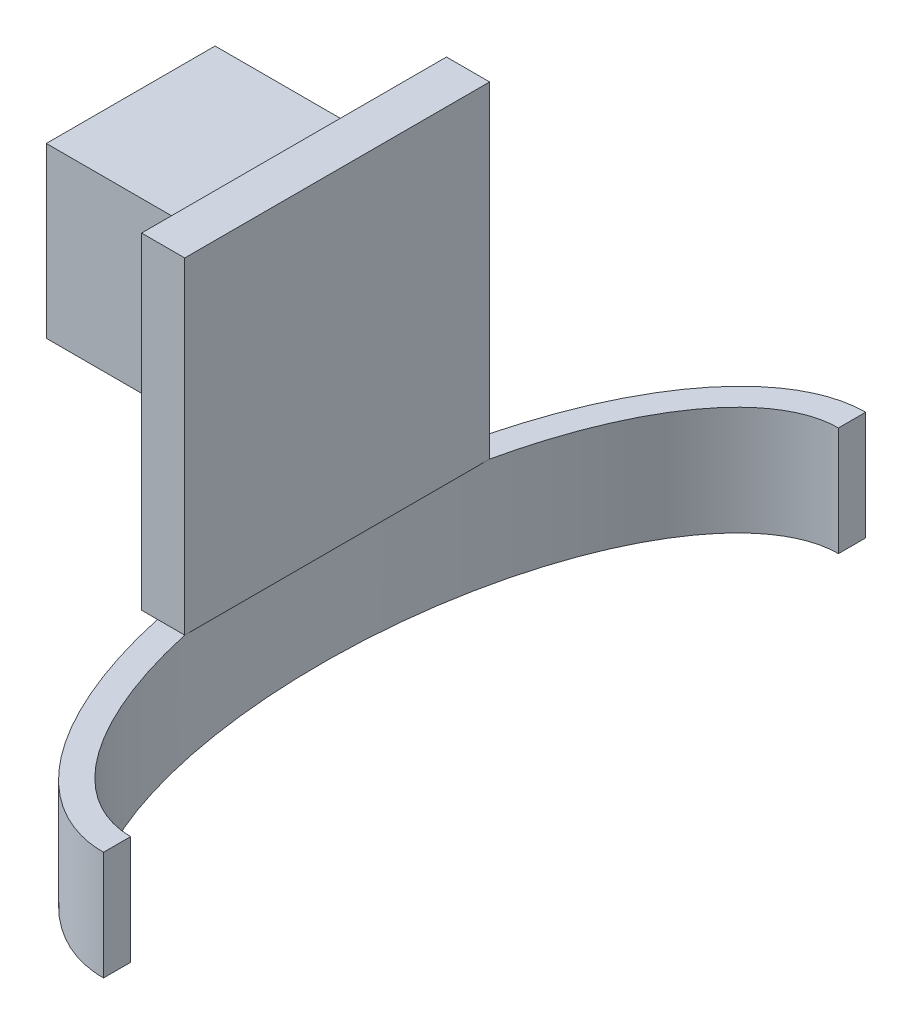
ISO-10303-21;
HEADER;
FILE_DESCRIPTION(('STEP AP214'),'2;1');
FILE_NAME('part.step','',(''),(''),'','','');
FILE_SCHEMA(('AUTOMOTIVE_DESIGN { 1 0 10303 214 1 1 1 1 }'));
ENDSEC;
DATA;
#1=APPLICATION_CONTEXT('core data for automotive mechanical design processes');
#2=APPLICATION_PROTOCOL_DEFINITION('international standard','automotive_design',2000,#1);
#3=PRODUCT_CONTEXT('',#1,'mechanical');
#4=PRODUCT('Part','Part','',(#3));
#5=PRODUCT_RELATED_PRODUCT_CATEGORY('part','',(#4));
#6=PRODUCT_DEFINITION_FORMATION('','',#4);
#7=PRODUCT_DEFINITION_CONTEXT('part definition',#1,'design');
#8=PRODUCT_DEFINITION('design','',#6,#7);
#9=PRODUCT_DEFINITION_SHAPE('','',#8);
#10=(LENGTH_UNIT() NAMED_UNIT(*) SI_UNIT(.MILLI.,.METRE.));
#11=(NAMED_UNIT(*) PLANE_ANGLE_UNIT() SI_UNIT($,.RADIAN.));
#12=(NAMED_UNIT(*) SI_UNIT($,.STERADIAN.) SOLID_ANGLE_UNIT());
#13=UNCERTAINTY_MEASURE_WITH_UNIT(LENGTH_MEASURE(1.E-05),#10,'distance_accuracy_value','');
#14=(GEOMETRIC_REPRESENTATION_CONTEXT(3) GLOBAL_UNCERTAINTY_ASSIGNED_CONTEXT((#13)) GLOBAL_UNIT_ASSIGNED_CONTEXT((#10,
#11,#12)) REPRESENTATION_CONTEXT('',''));
#15=CARTESIAN_POINT('',(0.,0.,0.));
#16=DIRECTION('',(0.,0.,1.));
#17=DIRECTION('',(1.,0.,0.));
#18=AXIS2_PLACEMENT_3D('',#15,#16,#17);
#19=CARTESIAN_POINT('',(-3.5,8.,2.8));
#20=DIRECTION('',(1.,0.,0.));
#21=DIRECTION('',(0.,0.,-1.));
#22=AXIS2_PLACEMENT_3D('',#19,#20,#21);
#23=PLANE('',#22);
#24=DIRECTION('',(0.,0.,1.));
#25=VECTOR('',#24,1.);
#26=CARTESIAN_POINT('',(-3.5,2.,2.8));
#27=LINE('',#26,#25);
#28=CARTESIAN_POINT('',(-3.5,2.,-2.8));
#29=VERTEX_POINT('',#28);
#30=CARTESIAN_POINT('',(-3.5,2.,0.));
#31=VERTEX_POINT('',#30);
#32=EDGE_CURVE('E203',#29,#31,#27,.T.);
#33=ORIENTED_EDGE('',*,*,#32,.T.);
#34=CARTESIAN_POINT('',(-3.5,2.,2.8));
#35=VERTEX_POINT('',#34);
#36=EDGE_CURVE('E202',#31,#35,#27,.T.);
#37=ORIENTED_EDGE('',*,*,#36,.T.);
#38=DIRECTION('',(0.,-1.,0.));
#39=VECTOR('',#38,1.);
#40=CARTESIAN_POINT('',(-3.5,8.,2.8));
#41=LINE('',#40,#39);
#42=CARTESIAN_POINT('',(-3.5,8.,2.8));
#43=VERTEX_POINT('',#42);
#44=EDGE_CURVE('E212',#43,#35,#41,.T.);
#45=ORIENTED_EDGE('',*,*,#44,.F.);
#46=DIRECTION('',(0.,0.,1.));
#47=VECTOR('',#46,1.);
#48=CARTESIAN_POINT('',(-3.5,8.,2.8));
#49=LINE('',#48,#47);
#50=CARTESIAN_POINT('',(-3.5,8.,-2.8));
#51=VERTEX_POINT('',#50);
#52=EDGE_CURVE('E191',#51,#43,#49,.T.);
#53=ORIENTED_EDGE('',*,*,#52,.F.);
#54=DIRECTION('',(0.,-1.,0.));
#55=VECTOR('',#54,1.);
#56=CARTESIAN_POINT('',(-3.5,8.,-2.8));
#57=LINE('',#56,#55);
#58=EDGE_CURVE('E216',#51,#29,#57,.T.);
#59=ORIENTED_EDGE('',*,*,#58,.T.);
#60=EDGE_LOOP('',(#33,#37,#45,#53,#59));
#61=FACE_BOUND('',#60,.T.);
#62=DIRECTION('',(0.,-1.,0.));
#63=VECTOR('',#62,1.);
#64=CARTESIAN_POINT('',(-3.5,7.3,-1.55));
#65=LINE('',#64,#63);
#66=CARTESIAN_POINT('',(-3.5,7.3,-1.55));
#67=VERTEX_POINT('',#66);
#68=CARTESIAN_POINT('',(-3.5,4.2,-1.55));
#69=VERTEX_POINT('',#68);
#70=EDGE_CURVE('E171',#67,#69,#65,.T.);
#71=ORIENTED_EDGE('',*,*,#70,.F.);
#72=DIRECTION('',(0.,0.,-1.));
#73=VECTOR('',#72,1.);
#74=CARTESIAN_POINT('',(-3.5,7.3,-1.55));
#75=LINE('',#74,#73);
#76=CARTESIAN_POINT('',(-3.5,7.3,1.55));
#77=VERTEX_POINT('',#76);
#78=EDGE_CURVE('E168',#77,#67,#75,.T.);
#79=ORIENTED_EDGE('',*,*,#78,.F.);
#80=DIRECTION('',(0.,1.,0.));
#81=VECTOR('',#80,1.);
#82=CARTESIAN_POINT('',(-3.5,7.3,1.55));
#83=LINE('',#82,#81);
#84=CARTESIAN_POINT('',(-3.5,4.2,1.55));
#85=VERTEX_POINT('',#84);
#86=EDGE_CURVE('E71',#85,#77,#83,.T.);
#87=ORIENTED_EDGE('',*,*,#86,.F.);
#88=DIRECTION('',(0.,0.,1.));
#89=VECTOR('',#88,1.);
#90=CARTESIAN_POINT('',(-3.5,4.2,-1.55));
#91=LINE('',#90,#89);
#92=EDGE_CURVE('E66',#69,#85,#91,.T.);
#93=ORIENTED_EDGE('',*,*,#92,.F.);
#94=EDGE_LOOP('',(#71,#79,#87,#93));
#95=FACE_BOUND('',#94,.T.);
#96=ADVANCED_FACE('F47',(#61,#95),#23,.F.);
#97=CARTESIAN_POINT('',(0.,2.,0.));
#98=DIRECTION('',(0.,1.,0.));
#99=DIRECTION('',(0.,0.,1.));
#100=AXIS2_PLACEMENT_3D('',#97,#98,#99);
#101=PLANE('',#100);
#102=DIRECTION('',(1.,0.,0.));
#103=VECTOR('',#102,1.);
#104=CARTESIAN_POINT('',(-2.70738634634999,2.,2.8));
#105=LINE('',#104,#103);
#106=CARTESIAN_POINT('',(-3.20780298646909,2.,2.8));
#107=VERTEX_POINT('',#106);
#108=CARTESIAN_POINT('',(-2.70738634634999,2.,2.8));
#109=VERTEX_POINT('',#108);
#110=EDGE_CURVE('E11',#107,#109,#105,.T.);
#111=ORIENTED_EDGE('',*,*,#110,.F.);
#112=CARTESIAN_POINT('',(0.,2.,0.));
#113=DIRECTION('',(0.,1.,0.));
#114=DIRECTION('',(0.,0.,1.));
#115=AXIS2_PLACEMENT_3D('',#112,#113,#114);
#116=ELLIPSE('',#115,7.,3.5);
#117=CARTESIAN_POINT('',(0.,2.,7.));
#118=VERTEX_POINT('',#117);
#119=EDGE_CURVE('E235',#107,#118,#116,.T.);
#120=ORIENTED_EDGE('',*,*,#119,.T.);
#121=DIRECTION('',(0.,0.,-1.));
#122=VECTOR('',#121,1.);
#123=CARTESIAN_POINT('',(0.,2.,0.));
#124=LINE('',#123,#122);
#125=CARTESIAN_POINT('',(0.,2.,6.5));
#126=VERTEX_POINT('',#125);
#127=EDGE_CURVE('E240',#118,#126,#124,.T.);
#128=ORIENTED_EDGE('',*,*,#127,.T.);
#129=CARTESIAN_POINT('',(0.,2.,0.));
#130=DIRECTION('',(0.,1.,0.));
#131=DIRECTION('',(0.,0.,-1.));
#132=AXIS2_PLACEMENT_3D('',#129,#130,#131);
#133=ELLIPSE('',#132,6.5,3.);
#134=EDGE_CURVE('E231',#109,#126,#133,.T.);
#135=ORIENTED_EDGE('',*,*,#134,.F.);
#136=EDGE_LOOP('',(#111,#120,#128,#135));
#137=FACE_BOUND('',#136,.T.);
#138=ADVANCED_FACE('F257',(#137),#101,.T.);
#139=DIRECTION('',(0.,-1.,0.));
#140=VECTOR('',#139,1.);
#141=SURFACE_OF_LINEAR_EXTRUSION('',#133,#140);
#142=CARTESIAN_POINT('',(0.,0.,0.));
#143=DIRECTION('',(0.,1.,0.));
#144=DIRECTION('',(0.,0.,-1.));
#145=AXIS2_PLACEMENT_3D('',#142,#143,#144);
#146=ELLIPSE('',#145,6.5,3.);
#147=CARTESIAN_POINT('',(0.,0.,-6.5));
#148=VERTEX_POINT('',#147);
#149=CARTESIAN_POINT('',(0.,0.,6.5));
#150=VERTEX_POINT('',#149);
#151=EDGE_CURVE('E223',#148,#150,#146,.T.);
#152=ORIENTED_EDGE('',*,*,#151,.F.);
#153=DIRECTION('',(0.,-1.,0.));
#154=VECTOR('',#153,1.);
#155=CARTESIAN_POINT('',(0.,2.,-6.5));
#156=LINE('',#155,#154);
#157=CARTESIAN_POINT('',(0.,2.,-6.5));
#158=VERTEX_POINT('',#157);
#159=EDGE_CURVE('E52',#158,#148,#156,.T.);
#160=ORIENTED_EDGE('',*,*,#159,.F.);
#161=CARTESIAN_POINT('',(-2.70738634634999,2.,-2.8));
#162=VERTEX_POINT('',#161);
#163=EDGE_CURVE('E224',#158,#162,#133,.T.);
#164=ORIENTED_EDGE('',*,*,#163,.T.);
#165=EDGE_CURVE('E230',#162,#109,#133,.T.);
#166=ORIENTED_EDGE('',*,*,#165,.T.);
#167=ORIENTED_EDGE('',*,*,#134,.T.);
#168=DIRECTION('',(0.,-1.,0.));
#169=VECTOR('',#168,1.);
#170=CARTESIAN_POINT('',(0.,2.,6.5));
#171=LINE('',#170,#169);
#172=EDGE_CURVE('E311',#126,#150,#171,.T.);
#173=ORIENTED_EDGE('',*,*,#172,.T.);
#174=EDGE_LOOP('',(#152,#160,#164,#166,#167,#173));
#175=FACE_BOUND('',#174,.T.);
#176=ADVANCED_FACE('F49',(#175),#141,.T.);
#177=CARTESIAN_POINT('',(0.,2.,0.));
#178=DIRECTION('',(1.,0.,0.));
#179=DIRECTION('',(0.,0.,-1.));
#180=AXIS2_PLACEMENT_3D('',#177,#178,#179);
#181=PLANE('',#180);
#182=DIRECTION('',(0.,0.,1.));
#183=VECTOR('',#182,1.);
#184=CARTESIAN_POINT('',(0.,0.,0.));
#185=LINE('',#184,#183);
#186=CARTESIAN_POINT('',(0.,0.,-7.));
#187=VERTEX_POINT('',#186);
#188=EDGE_CURVE('E301',#187,#148,#185,.T.);
#189=ORIENTED_EDGE('',*,*,#188,.F.);
#190=DIRECTION('',(0.,-1.,0.));
#191=VECTOR('',#190,1.);
#192=CARTESIAN_POINT('',(0.,2.,-7.));
#193=LINE('',#192,#191);
#194=CARTESIAN_POINT('',(0.,2.,-7.));
#195=VERTEX_POINT('',#194);
#196=EDGE_CURVE('E317',#195,#187,#193,.T.);
#197=ORIENTED_EDGE('',*,*,#196,.F.);
#198=DIRECTION('',(0.,0.,1.));
#199=VECTOR('',#198,1.);
#200=CARTESIAN_POINT('',(0.,2.,0.));
#201=LINE('',#200,#199);
#202=EDGE_CURVE('E229',#195,#158,#201,.T.);
#203=ORIENTED_EDGE('',*,*,#202,.T.);
#204=ORIENTED_EDGE('',*,*,#159,.T.);
#205=EDGE_LOOP('',(#189,#197,#203,#204));
#206=FACE_BOUND('',#205,.T.);
#207=ADVANCED_FACE('F248',(#206),#181,.T.);
#208=DIRECTION('',(0.,-1.,0.));
#209=VECTOR('',#208,1.);
#210=SURFACE_OF_LINEAR_EXTRUSION('',#116,#209);
#211=CARTESIAN_POINT('',(0.,0.,0.));
#212=DIRECTION('',(0.,1.,0.));
#213=DIRECTION('',(0.,0.,1.));
#214=AXIS2_PLACEMENT_3D('',#211,#212,#213);
#215=ELLIPSE('',#214,7.,3.5);
#216=CARTESIAN_POINT('',(0.,0.,7.));
#217=VERTEX_POINT('',#216);
#218=EDGE_CURVE('E304',#187,#217,#215,.T.);
#219=ORIENTED_EDGE('',*,*,#218,.T.);
#220=DIRECTION('',(0.,-1.,0.));
#221=VECTOR('',#220,1.);
#222=CARTESIAN_POINT('',(0.,2.,7.));
#223=LINE('',#222,#221);
#224=EDGE_CURVE('E314',#118,#217,#223,.T.);
#225=ORIENTED_EDGE('',*,*,#224,.F.);
#226=ORIENTED_EDGE('',*,*,#119,.F.);
#227=EDGE_CURVE('E342',#31,#107,#116,.T.);
#228=ORIENTED_EDGE('',*,*,#227,.F.);
#229=CARTESIAN_POINT('',(-3.20780298646909,2.,-2.8));
#230=VERTEX_POINT('',#229);
#231=EDGE_CURVE('E241',#230,#31,#116,.T.);
#232=ORIENTED_EDGE('',*,*,#231,.F.);
#233=EDGE_CURVE('E236',#195,#230,#116,.T.);
#234=ORIENTED_EDGE('',*,*,#233,.F.);
#235=ORIENTED_EDGE('',*,*,#196,.T.);
#236=EDGE_LOOP('',(#219,#225,#226,#228,#232,#234,#235));
#237=FACE_BOUND('',#236,.T.);
#238=ADVANCED_FACE('F244',(#237),#210,.F.);
#239=CARTESIAN_POINT('',(0.,2.,0.));
#240=DIRECTION('',(-1.,0.,0.));
#241=DIRECTION('',(0.,0.,1.));
#242=AXIS2_PLACEMENT_3D('',#239,#240,#241);
#243=PLANE('',#242);
#244=DIRECTION('',(0.,0.,-1.));
#245=VECTOR('',#244,1.);
#246=CARTESIAN_POINT('',(0.,0.,0.));
#247=LINE('',#246,#245);
#248=EDGE_CURVE('E300',#217,#150,#247,.T.);
#249=ORIENTED_EDGE('',*,*,#248,.T.);
#250=ORIENTED_EDGE('',*,*,#172,.F.);
#251=ORIENTED_EDGE('',*,*,#127,.F.);
#252=ORIENTED_EDGE('',*,*,#224,.T.);
#253=EDGE_LOOP('',(#249,#250,#251,#252));
#254=FACE_BOUND('',#253,.T.);
#255=ADVANCED_FACE('F247',(#254),#243,.F.);
#256=DIRECTION('',(-1.,0.,0.));
#257=VECTOR('',#256,1.);
#258=CARTESIAN_POINT('',(-3.5,2.,-2.8));
#259=LINE('',#258,#257);
#260=EDGE_CURVE('E198',#162,#230,#259,.T.);
#261=ORIENTED_EDGE('',*,*,#260,.F.);
#262=ORIENTED_EDGE('',*,*,#163,.F.);
#263=ORIENTED_EDGE('',*,*,#202,.F.);
#264=ORIENTED_EDGE('',*,*,#233,.T.);
#265=EDGE_LOOP('',(#261,#262,#263,#264));
#266=FACE_BOUND('',#265,.T.);
#267=ADVANCED_FACE('F270',(#266),#101,.T.);
#268=CARTESIAN_POINT('',(0.,0.,0.));
#269=DIRECTION('',(0.,1.,0.));
#270=DIRECTION('',(0.,0.,1.));
#271=AXIS2_PLACEMENT_3D('',#268,#269,#270);
#272=PLANE('',#271);
#273=ORIENTED_EDGE('',*,*,#151,.T.);
#274=ORIENTED_EDGE('',*,*,#248,.F.);
#275=ORIENTED_EDGE('',*,*,#218,.F.);
#276=ORIENTED_EDGE('',*,*,#188,.T.);
#277=EDGE_LOOP('',(#273,#274,#275,#276));
#278=FACE_BOUND('',#277,.T.);
#279=ADVANCED_FACE('F284',(#278),#272,.F.);
#280=CARTESIAN_POINT('',(0.,2.,0.));
#281=DIRECTION('',(0.,-1.,0.));
#282=DIRECTION('',(0.,0.,-1.));
#283=AXIS2_PLACEMENT_3D('',#280,#281,#282);
#284=PLANE('',#283);
#285=ORIENTED_EDGE('',*,*,#165,.F.);
#286=DIRECTION('',(0.,0.,-1.));
#287=VECTOR('',#286,1.);
#288=CARTESIAN_POINT('',(-2.70738634634999,2.,-2.8));
#289=LINE('',#288,#287);
#290=EDGE_CURVE('E173',#109,#162,#289,.T.);
#291=ORIENTED_EDGE('',*,*,#290,.F.);
#292=EDGE_LOOP('',(#285,#291));
#293=FACE_BOUND('',#292,.T.);
#294=ADVANCED_FACE('F287',(#293),#284,.T.);
#295=EDGE_CURVE('E178',#230,#29,#259,.T.);
#296=ORIENTED_EDGE('',*,*,#295,.F.);
#297=ORIENTED_EDGE('',*,*,#231,.T.);
#298=ORIENTED_EDGE('',*,*,#32,.F.);
#299=EDGE_LOOP('',(#296,#297,#298));
#300=FACE_BOUND('',#299,.T.);
#301=ADVANCED_FACE('F281',(#300),#284,.T.);
#302=CARTESIAN_POINT('',(-2.70738634634999,8.,-2.8));
#303=DIRECTION('',(-1.,0.,0.));
#304=DIRECTION('',(0.,0.,1.));
#305=AXIS2_PLACEMENT_3D('',#302,#303,#304);
#306=PLANE('',#305);
#307=ORIENTED_EDGE('',*,*,#290,.T.);
#308=DIRECTION('',(0.,-1.,0.));
#309=VECTOR('',#308,1.);
#310=CARTESIAN_POINT('',(-2.70738634634999,8.,-2.8));
#311=LINE('',#310,#309);
#312=CARTESIAN_POINT('',(-2.70738634634999,8.,-2.8));
#313=VERTEX_POINT('',#312);
#314=EDGE_CURVE('E220',#313,#162,#311,.T.);
#315=ORIENTED_EDGE('',*,*,#314,.F.);
#316=DIRECTION('',(0.,0.,-1.));
#317=VECTOR('',#316,1.);
#318=CARTESIAN_POINT('',(-2.70738634634999,8.,-2.8));
#319=LINE('',#318,#317);
#320=CARTESIAN_POINT('',(-2.70738634634999,8.,2.8));
#321=VERTEX_POINT('',#320);
#322=EDGE_CURVE('E184',#321,#313,#319,.T.);
#323=ORIENTED_EDGE('',*,*,#322,.F.);
#324=DIRECTION('',(0.,-1.,0.));
#325=VECTOR('',#324,1.);
#326=CARTESIAN_POINT('',(-2.70738634634999,8.,2.8));
#327=LINE('',#326,#325);
#328=EDGE_CURVE('E196',#321,#109,#327,.T.);
#329=ORIENTED_EDGE('',*,*,#328,.T.);
#330=EDGE_LOOP('',(#307,#315,#323,#329));
#331=FACE_BOUND('',#330,.T.);
#332=ADVANCED_FACE('F278',(#331),#306,.F.);
#333=CARTESIAN_POINT('',(-3.5,8.,-2.8));
#334=DIRECTION('',(0.,0.,1.));
#335=DIRECTION('',(1.,0.,0.));
#336=AXIS2_PLACEMENT_3D('',#333,#334,#335);
#337=PLANE('',#336);
#338=ORIENTED_EDGE('',*,*,#260,.T.);
#339=ORIENTED_EDGE('',*,*,#295,.T.);
#340=ORIENTED_EDGE('',*,*,#58,.F.);
#341=DIRECTION('',(-1.,0.,0.));
#342=VECTOR('',#341,1.);
#343=CARTESIAN_POINT('',(-3.5,8.,-2.8));
#344=LINE('',#343,#342);
#345=EDGE_CURVE('E188',#313,#51,#344,.T.);
#346=ORIENTED_EDGE('',*,*,#345,.F.);
#347=ORIENTED_EDGE('',*,*,#314,.T.);
#348=EDGE_LOOP('',(#338,#339,#340,#346,#347));
#349=FACE_BOUND('',#348,.T.);
#350=ADVANCED_FACE('F275',(#349),#337,.F.);
#351=CARTESIAN_POINT('',(-2.70738634634999,8.,2.8));
#352=DIRECTION('',(0.,0.,-1.));
#353=DIRECTION('',(-1.,0.,0.));
#354=AXIS2_PLACEMENT_3D('',#351,#352,#353);
#355=PLANE('',#354);
#356=EDGE_CURVE('E59',#35,#107,#105,.T.);
#357=ORIENTED_EDGE('',*,*,#356,.T.);
#358=ORIENTED_EDGE('',*,*,#110,.T.);
#359=ORIENTED_EDGE('',*,*,#328,.F.);
#360=DIRECTION('',(1.,0.,0.));
#361=VECTOR('',#360,1.);
#362=CARTESIAN_POINT('',(-2.70738634634999,8.,2.8));
#363=LINE('',#362,#361);
#364=EDGE_CURVE('E194',#43,#321,#363,.T.);
#365=ORIENTED_EDGE('',*,*,#364,.F.);
#366=ORIENTED_EDGE('',*,*,#44,.T.);
#367=EDGE_LOOP('',(#357,#358,#359,#365,#366));
#368=FACE_BOUND('',#367,.T.);
#369=ADVANCED_FACE('F273',(#368),#355,.F.);
#370=CARTESIAN_POINT('',(0.,8.,0.));
#371=DIRECTION('',(0.,-1.,0.));
#372=DIRECTION('',(0.,0.,-1.));
#373=AXIS2_PLACEMENT_3D('',#370,#371,#372);
#374=PLANE('',#373);
#375=ORIENTED_EDGE('',*,*,#322,.T.);
#376=ORIENTED_EDGE('',*,*,#345,.T.);
#377=ORIENTED_EDGE('',*,*,#52,.T.);
#378=ORIENTED_EDGE('',*,*,#364,.T.);
#379=EDGE_LOOP('',(#375,#376,#377,#378));
#380=FACE_BOUND('',#379,.T.);
#381=ADVANCED_FACE('F362',(#380),#374,.F.);
#382=ORIENTED_EDGE('',*,*,#36,.F.);
#383=ORIENTED_EDGE('',*,*,#227,.T.);
#384=ORIENTED_EDGE('',*,*,#356,.F.);
#385=EDGE_LOOP('',(#382,#383,#384));
#386=FACE_BOUND('',#385,.T.);
#387=ADVANCED_FACE('F293',(#386),#284,.T.);
#388=CARTESIAN_POINT('',(-6.5,7.3,-1.55));
#389=DIRECTION('',(0.,0.,1.));
#390=DIRECTION('',(1.,0.,0.));
#391=AXIS2_PLACEMENT_3D('',#388,#389,#390);
#392=PLANE('',#391);
#393=ORIENTED_EDGE('',*,*,#70,.T.);
#394=DIRECTION('',(1.,0.,0.));
#395=VECTOR('',#394,1.);
#396=CARTESIAN_POINT('',(-6.5,4.2,-1.55));
#397=LINE('',#396,#395);
#398=CARTESIAN_POINT('',(-6.5,4.2,-1.55));
#399=VERTEX_POINT('',#398);
#400=EDGE_CURVE('E150',#399,#69,#397,.T.);
#401=ORIENTED_EDGE('',*,*,#400,.F.);
#402=DIRECTION('',(0.,-1.,0.));
#403=VECTOR('',#402,1.);
#404=CARTESIAN_POINT('',(-6.5,7.3,-1.55));
#405=LINE('',#404,#403);
#406=CARTESIAN_POINT('',(-6.5,7.3,-1.55));
#407=VERTEX_POINT('',#406);
#408=EDGE_CURVE('E158',#407,#399,#405,.T.);
#409=ORIENTED_EDGE('',*,*,#408,.F.);
#410=DIRECTION('',(1.,0.,0.));
#411=VECTOR('',#410,1.);
#412=CARTESIAN_POINT('',(-6.5,7.3,-1.55));
#413=LINE('',#412,#411);
#414=EDGE_CURVE('E496',#407,#67,#413,.T.);
#415=ORIENTED_EDGE('',*,*,#414,.T.);
#416=EDGE_LOOP('',(#393,#401,#409,#415));
#417=FACE_BOUND('',#416,.T.);
#418=ADVANCED_FACE('F170',(#417),#392,.F.);
#419=CARTESIAN_POINT('',(-6.5,4.2,-1.55));
#420=DIRECTION('',(0.,1.,0.));
#421=DIRECTION('',(0.,0.,1.));
#422=AXIS2_PLACEMENT_3D('',#419,#420,#421);
#423=PLANE('',#422);
#424=ORIENTED_EDGE('',*,*,#92,.T.);
#425=DIRECTION('',(1.,0.,0.));
#426=VECTOR('',#425,1.);
#427=CARTESIAN_POINT('',(-6.5,4.2,1.55));
#428=LINE('',#427,#426);
#429=CARTESIAN_POINT('',(-6.5,4.2,1.55));
#430=VERTEX_POINT('',#429);
#431=EDGE_CURVE('E153',#430,#85,#428,.T.);
#432=ORIENTED_EDGE('',*,*,#431,.F.);
#433=DIRECTION('',(0.,0.,1.));
#434=VECTOR('',#433,1.);
#435=CARTESIAN_POINT('',(-6.5,4.2,-1.55));
#436=LINE('',#435,#434);
#437=EDGE_CURVE('E146',#399,#430,#436,.T.);
#438=ORIENTED_EDGE('',*,*,#437,.F.);
#439=ORIENTED_EDGE('',*,*,#400,.T.);
#440=EDGE_LOOP('',(#424,#432,#438,#439));
#441=FACE_BOUND('',#440,.T.);
#442=ADVANCED_FACE('F148',(#441),#423,.F.);
#443=CARTESIAN_POINT('',(-6.5,7.3,1.55));
#444=DIRECTION('',(0.,0.,-1.));
#445=DIRECTION('',(0.,1.,0.));
#446=AXIS2_PLACEMENT_3D('',#443,#444,#445);
#447=PLANE('',#446);
#448=ORIENTED_EDGE('',*,*,#86,.T.);
#449=DIRECTION('',(1.,0.,0.));
#450=VECTOR('',#449,1.);
#451=CARTESIAN_POINT('',(-6.5,7.3,1.55));
#452=LINE('',#451,#450);
#453=CARTESIAN_POINT('',(-6.5,7.3,1.55));
#454=VERTEX_POINT('',#453);
#455=EDGE_CURVE('E180',#454,#77,#452,.T.);
#456=ORIENTED_EDGE('',*,*,#455,.F.);
#457=DIRECTION('',(0.,1.,0.));
#458=VECTOR('',#457,1.);
#459=CARTESIAN_POINT('',(-6.5,7.3,1.55));
#460=LINE('',#459,#458);
#461=EDGE_CURVE('E157',#430,#454,#460,.T.);
#462=ORIENTED_EDGE('',*,*,#461,.F.);
#463=ORIENTED_EDGE('',*,*,#431,.T.);
#464=EDGE_LOOP('',(#448,#456,#462,#463));
#465=FACE_BOUND('',#464,.T.);
#466=ADVANCED_FACE('F374',(#465),#447,.F.);
#467=CARTESIAN_POINT('',(-6.5,7.3,-1.55));
#468=DIRECTION('',(0.,-1.,0.));
#469=DIRECTION('',(0.,0.,-1.));
#470=AXIS2_PLACEMENT_3D('',#467,#468,#469);
#471=PLANE('',#470);
#472=ORIENTED_EDGE('',*,*,#78,.T.);
#473=ORIENTED_EDGE('',*,*,#414,.F.);
#474=DIRECTION('',(0.,0.,-1.));
#475=VECTOR('',#474,1.);
#476=CARTESIAN_POINT('',(-6.5,7.3,-1.55));
#477=LINE('',#476,#475);
#478=EDGE_CURVE('E163',#454,#407,#477,.T.);
#479=ORIENTED_EDGE('',*,*,#478,.F.);
#480=ORIENTED_EDGE('',*,*,#455,.T.);
#481=EDGE_LOOP('',(#472,#473,#479,#480));
#482=FACE_BOUND('',#481,.T.);
#483=ADVANCED_FACE('F377',(#482),#471,.F.);
#484=CARTESIAN_POINT('',(-6.5,0.,0.));
#485=DIRECTION('',(-1.,0.,0.));
#486=DIRECTION('',(0.,0.,1.));
#487=AXIS2_PLACEMENT_3D('',#484,#485,#486);
#488=PLANE('',#487);
#489=ORIENTED_EDGE('',*,*,#408,.T.);
#490=ORIENTED_EDGE('',*,*,#437,.T.);
#491=ORIENTED_EDGE('',*,*,#461,.T.);
#492=ORIENTED_EDGE('',*,*,#478,.T.);
#493=EDGE_LOOP('',(#489,#490,#491,#492));
#494=FACE_BOUND('',#493,.T.);
#495=ADVANCED_FACE('F161',(#494),#488,.T.);
#496=CLOSED_SHELL('',(#96,#138,#176,#207,#238,#255,#267,#279,#294,#301,#332,#350,#369,#381,#387,
#418,#442,#466,#483,#495));
#497=MANIFOLD_SOLID_BREP('B2',#496);
#498=ADVANCED_BREP_SHAPE_REPRESENTATION('',(#18,#497),#14);
#499=SHAPE_DEFINITION_REPRESENTATION(#9,#498);
ENDSEC;
END-ISO-10303-21;
